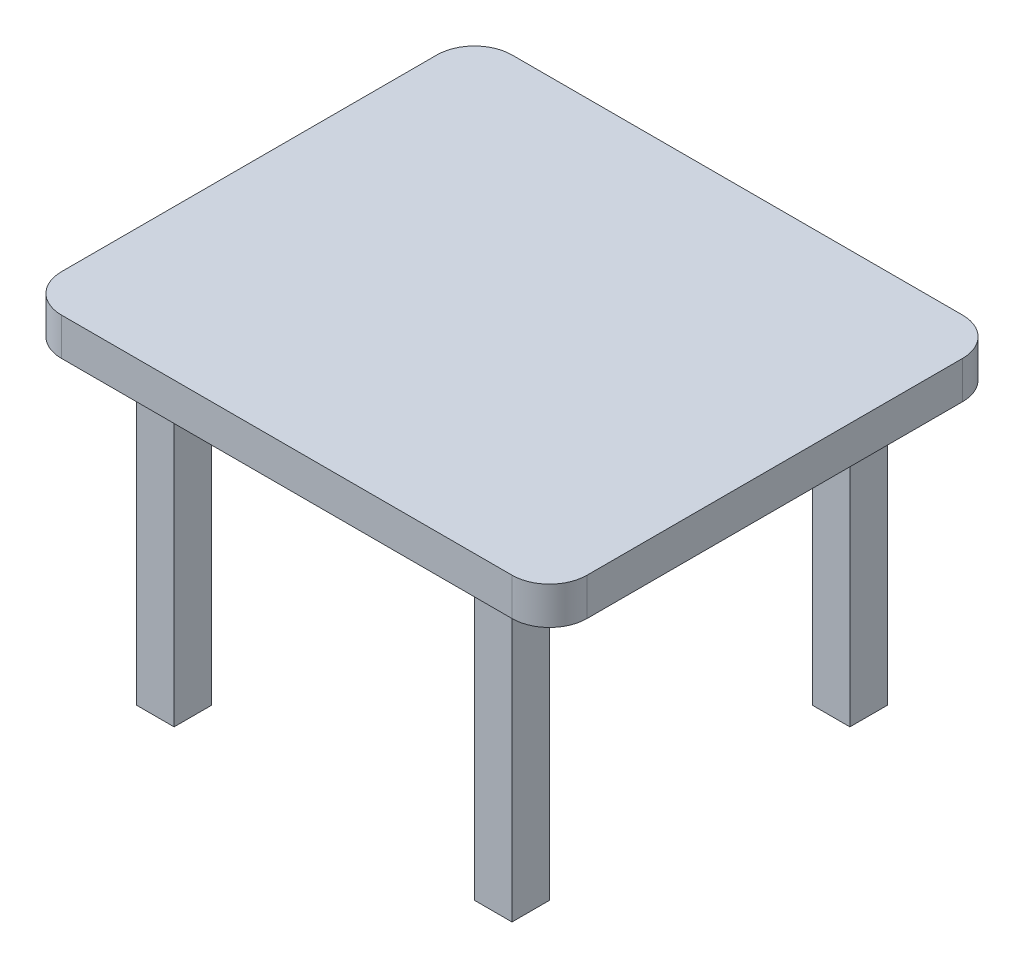
ISO-10303-21;
HEADER;
FILE_DESCRIPTION(('STEP AP214'),'2;1');
FILE_NAME('part.step','',(''),(''),'','','');
FILE_SCHEMA(('AUTOMOTIVE_DESIGN { 1 0 10303 214 1 1 1 1 }'));
ENDSEC;
DATA;
#1=APPLICATION_CONTEXT('core data for automotive mechanical design processes');
#2=APPLICATION_PROTOCOL_DEFINITION('international standard','automotive_design',2000,#1);
#3=PRODUCT_CONTEXT('',#1,'mechanical');
#4=PRODUCT('Part','Part','',(#3));
#5=PRODUCT_RELATED_PRODUCT_CATEGORY('part','',(#4));
#6=PRODUCT_DEFINITION_FORMATION('','',#4);
#7=PRODUCT_DEFINITION_CONTEXT('part definition',#1,'design');
#8=PRODUCT_DEFINITION('design','',#6,#7);
#9=PRODUCT_DEFINITION_SHAPE('','',#8);
#10=(LENGTH_UNIT() NAMED_UNIT(*) SI_UNIT(.MILLI.,.METRE.));
#11=(NAMED_UNIT(*) PLANE_ANGLE_UNIT() SI_UNIT($,.RADIAN.));
#12=(NAMED_UNIT(*) SI_UNIT($,.STERADIAN.) SOLID_ANGLE_UNIT());
#13=UNCERTAINTY_MEASURE_WITH_UNIT(LENGTH_MEASURE(1.E-05),#10,'distance_accuracy_value','');
#14=(GEOMETRIC_REPRESENTATION_CONTEXT(3) GLOBAL_UNCERTAINTY_ASSIGNED_CONTEXT((#13)) GLOBAL_UNIT_ASSIGNED_CONTEXT((#10,
#11,#12)) REPRESENTATION_CONTEXT('',''));
#15=CARTESIAN_POINT('',(0.,0.,0.));
#16=DIRECTION('',(0.,0.,1.));
#17=DIRECTION('',(1.,0.,0.));
#18=AXIS2_PLACEMENT_3D('',#15,#16,#17);
#19=CARTESIAN_POINT('',(0.,80.,0.));
#20=DIRECTION('',(0.,1.,0.));
#21=DIRECTION('',(0.,0.,1.));
#22=AXIS2_PLACEMENT_3D('',#19,#20,#21);
#23=PLANE('',#22);
#24=DIRECTION('',(-1.,0.,0.));
#25=VECTOR('',#24,1.);
#26=CARTESIAN_POINT('',(-90.,80.,-10.));
#27=LINE('',#26,#25);
#28=CARTESIAN_POINT('',(-90.,80.,-10.));
#29=VERTEX_POINT('',#28);
#30=CARTESIAN_POINT('',(-100.,80.,-10.));
#31=VERTEX_POINT('',#30);
#32=EDGE_CURVE('E237',#29,#31,#27,.T.);
#33=ORIENTED_EDGE('',*,*,#32,.T.);
#34=DIRECTION('',(0.,0.,1.));
#35=VECTOR('',#34,1.);
#36=CARTESIAN_POINT('',(-100.,80.,-10.));
#37=LINE('',#36,#35);
#38=CARTESIAN_POINT('',(-100.,80.,0.));
#39=VERTEX_POINT('',#38);
#40=EDGE_CURVE('E239',#31,#39,#37,.T.);
#41=ORIENTED_EDGE('',*,*,#40,.T.);
#42=DIRECTION('',(1.,0.,0.));
#43=VECTOR('',#42,1.);
#44=CARTESIAN_POINT('',(-90.,80.,0.));
#45=LINE('',#44,#43);
#46=CARTESIAN_POINT('',(-90.,80.,0.));
#47=VERTEX_POINT('',#46);
#48=EDGE_CURVE('E242',#39,#47,#45,.T.);
#49=ORIENTED_EDGE('',*,*,#48,.T.);
#50=DIRECTION('',(0.,0.,-1.));
#51=VECTOR('',#50,1.);
#52=CARTESIAN_POINT('',(-90.,80.,-10.));
#53=LINE('',#52,#51);
#54=EDGE_CURVE('E244',#47,#29,#53,.T.);
#55=ORIENTED_EDGE('',*,*,#54,.T.);
#56=EDGE_LOOP('',(#33,#41,#49,#55));
#57=FACE_BOUND('',#56,.T.);
#58=DIRECTION('',(1.,0.,0.));
#59=VECTOR('',#58,1.);
#60=CARTESIAN_POINT('',(-10.,80.,0.));
#61=LINE('',#60,#59);
#62=CARTESIAN_POINT('',(-10.,80.,0.));
#63=VERTEX_POINT('',#62);
#64=CARTESIAN_POINT('',(0.,80.,0.));
#65=VERTEX_POINT('',#64);
#66=EDGE_CURVE('E326',#63,#65,#61,.T.);
#67=ORIENTED_EDGE('',*,*,#66,.T.);
#68=DIRECTION('',(0.,0.,-1.));
#69=VECTOR('',#68,1.);
#70=CARTESIAN_POINT('',(0.,80.,-10.));
#71=LINE('',#70,#69);
#72=CARTESIAN_POINT('',(0.,80.,-10.));
#73=VERTEX_POINT('',#72);
#74=EDGE_CURVE('E316',#65,#73,#71,.T.);
#75=ORIENTED_EDGE('',*,*,#74,.T.);
#76=DIRECTION('',(-1.,0.,0.));
#77=VECTOR('',#76,1.);
#78=CARTESIAN_POINT('',(-10.,80.,-10.));
#79=LINE('',#78,#77);
#80=CARTESIAN_POINT('',(-10.,80.,-10.));
#81=VERTEX_POINT('',#80);
#82=EDGE_CURVE('E319',#73,#81,#79,.T.);
#83=ORIENTED_EDGE('',*,*,#82,.T.);
#84=DIRECTION('',(0.,0.,1.));
#85=VECTOR('',#84,1.);
#86=CARTESIAN_POINT('',(-10.,80.,-10.));
#87=LINE('',#86,#85);
#88=EDGE_CURVE('E323',#81,#63,#87,.T.);
#89=ORIENTED_EDGE('',*,*,#88,.T.);
#90=EDGE_LOOP('',(#67,#75,#83,#89));
#91=FACE_BOUND('',#90,.T.);
#92=DIRECTION('',(0.,0.,1.));
#93=VECTOR('',#92,1.);
#94=CARTESIAN_POINT('',(-120.,80.,-110.));
#95=LINE('',#94,#93);
#96=CARTESIAN_POINT('',(-120.,80.,-100.));
#97=VERTEX_POINT('',#96);
#98=CARTESIAN_POINT('',(-120.,80.,0.));
#99=VERTEX_POINT('',#98);
#100=EDGE_CURVE('E294',#97,#99,#95,.T.);
#101=ORIENTED_EDGE('',*,*,#100,.F.);
#102=CARTESIAN_POINT('',(-110.,80.,-100.));
#103=DIRECTION('',(0.,1.,0.));
#104=DIRECTION('',(0.,0.,1.));
#105=AXIS2_PLACEMENT_3D('',#102,#103,#104);
#106=CIRCLE('',#105,10.);
#107=CARTESIAN_POINT('',(-110.,80.,-110.));
#108=VERTEX_POINT('',#107);
#109=EDGE_CURVE('E359',#97,#108,#106,.F.);
#110=ORIENTED_EDGE('',*,*,#109,.T.);
#111=DIRECTION('',(-1.,0.,0.));
#112=VECTOR('',#111,1.);
#113=CARTESIAN_POINT('',(-120.,80.,-110.));
#114=LINE('',#113,#112);
#115=CARTESIAN_POINT('',(9.99999999999999,80.,-110.));
#116=VERTEX_POINT('',#115);
#117=EDGE_CURVE('E299',#116,#108,#114,.T.);
#118=ORIENTED_EDGE('',*,*,#117,.F.);
#119=CARTESIAN_POINT('',(9.99999999999999,80.,-100.));
#120=DIRECTION('',(0.,1.,0.));
#121=DIRECTION('',(0.,0.,1.));
#122=AXIS2_PLACEMENT_3D('',#119,#120,#121);
#123=CIRCLE('',#122,10.);
#124=CARTESIAN_POINT('',(20.,80.,-100.));
#125=VERTEX_POINT('',#124);
#126=EDGE_CURVE('E357',#116,#125,#123,.F.);
#127=ORIENTED_EDGE('',*,*,#126,.T.);
#128=DIRECTION('',(0.,0.,-1.));
#129=VECTOR('',#128,1.);
#130=CARTESIAN_POINT('',(20.,80.,-110.));
#131=LINE('',#130,#129);
#132=CARTESIAN_POINT('',(20.,80.,0.));
#133=VERTEX_POINT('',#132);
#134=EDGE_CURVE('E312',#133,#125,#131,.T.);
#135=ORIENTED_EDGE('',*,*,#134,.F.);
#136=CARTESIAN_POINT('',(10.,80.,0.));
#137=DIRECTION('',(0.,1.,0.));
#138=DIRECTION('',(0.,0.,1.));
#139=AXIS2_PLACEMENT_3D('',#136,#137,#138);
#140=CIRCLE('',#139,10.);
#141=CARTESIAN_POINT('',(10.,80.,10.));
#142=VERTEX_POINT('',#141);
#143=EDGE_CURVE('E353',#133,#142,#140,.F.);
#144=ORIENTED_EDGE('',*,*,#143,.T.);
#145=DIRECTION('',(1.,0.,0.));
#146=VECTOR('',#145,1.);
#147=CARTESIAN_POINT('',(-120.,80.,10.));
#148=LINE('',#147,#146);
#149=CARTESIAN_POINT('',(-110.,80.,10.));
#150=VERTEX_POINT('',#149);
#151=EDGE_CURVE('E309',#150,#142,#148,.T.);
#152=ORIENTED_EDGE('',*,*,#151,.F.);
#153=CARTESIAN_POINT('',(-110.,80.,0.));
#154=DIRECTION('',(0.,1.,0.));
#155=DIRECTION('',(0.,0.,1.));
#156=AXIS2_PLACEMENT_3D('',#153,#154,#155);
#157=CIRCLE('',#156,10.);
#158=EDGE_CURVE('E355',#150,#99,#157,.F.);
#159=ORIENTED_EDGE('',*,*,#158,.T.);
#160=EDGE_LOOP('',(#101,#110,#118,#127,#135,#144,#152,#159));
#161=FACE_BOUND('',#160,.T.);
#162=DIRECTION('',(0.,0.,-1.));
#163=VECTOR('',#162,1.);
#164=CARTESIAN_POINT('',(0.,80.,-100.));
#165=LINE('',#164,#163);
#166=CARTESIAN_POINT('',(0.,80.,-90.));
#167=VERTEX_POINT('',#166);
#168=CARTESIAN_POINT('',(0.,80.,-100.));
#169=VERTEX_POINT('',#168);
#170=EDGE_CURVE('E266',#167,#169,#165,.T.);
#171=ORIENTED_EDGE('',*,*,#170,.T.);
#172=DIRECTION('',(-1.,0.,0.));
#173=VECTOR('',#172,1.);
#174=CARTESIAN_POINT('',(-10.,80.,-100.));
#175=LINE('',#174,#173);
#176=CARTESIAN_POINT('',(-10.,80.,-100.));
#177=VERTEX_POINT('',#176);
#178=EDGE_CURVE('E268',#169,#177,#175,.T.);
#179=ORIENTED_EDGE('',*,*,#178,.T.);
#180=DIRECTION('',(0.,0.,1.));
#181=VECTOR('',#180,1.);
#182=CARTESIAN_POINT('',(-10.,80.,-100.));
#183=LINE('',#182,#181);
#184=CARTESIAN_POINT('',(-10.,80.,-90.));
#185=VERTEX_POINT('',#184);
#186=EDGE_CURVE('E271',#177,#185,#183,.T.);
#187=ORIENTED_EDGE('',*,*,#186,.T.);
#188=DIRECTION('',(1.,0.,0.));
#189=VECTOR('',#188,1.);
#190=CARTESIAN_POINT('',(-10.,80.,-90.));
#191=LINE('',#190,#189);
#192=EDGE_CURVE('E273',#185,#167,#191,.T.);
#193=ORIENTED_EDGE('',*,*,#192,.T.);
#194=EDGE_LOOP('',(#171,#179,#187,#193));
#195=FACE_BOUND('',#194,.T.);
#196=DIRECTION('',(-1.,0.,0.));
#197=VECTOR('',#196,1.);
#198=CARTESIAN_POINT('',(-90.,80.,-100.));
#199=LINE('',#198,#197);
#200=CARTESIAN_POINT('',(-90.,80.,-100.));
#201=VERTEX_POINT('',#200);
#202=CARTESIAN_POINT('',(-100.,80.,-100.));
#203=VERTEX_POINT('',#202);
#204=EDGE_CURVE('E230',#201,#203,#199,.T.);
#205=ORIENTED_EDGE('',*,*,#204,.T.);
#206=DIRECTION('',(0.,0.,1.));
#207=VECTOR('',#206,1.);
#208=CARTESIAN_POINT('',(-100.,80.,-100.));
#209=LINE('',#208,#207);
#210=CARTESIAN_POINT('',(-100.,80.,-90.));
#211=VERTEX_POINT('',#210);
#212=EDGE_CURVE('E201',#203,#211,#209,.T.);
#213=ORIENTED_EDGE('',*,*,#212,.T.);
#214=DIRECTION('',(1.,0.,0.));
#215=VECTOR('',#214,1.);
#216=CARTESIAN_POINT('',(-90.,80.,-90.));
#217=LINE('',#216,#215);
#218=CARTESIAN_POINT('',(-90.,80.,-90.));
#219=VERTEX_POINT('',#218);
#220=EDGE_CURVE('E195',#211,#219,#217,.T.);
#221=ORIENTED_EDGE('',*,*,#220,.T.);
#222=DIRECTION('',(0.,0.,-1.));
#223=VECTOR('',#222,1.);
#224=CARTESIAN_POINT('',(-90.,80.,-100.));
#225=LINE('',#224,#223);
#226=EDGE_CURVE('E198',#219,#201,#225,.T.);
#227=ORIENTED_EDGE('',*,*,#226,.T.);
#228=EDGE_LOOP('',(#205,#213,#221,#227));
#229=FACE_BOUND('',#228,.T.);
#230=ADVANCED_FACE('F33',(#57,#91,#161,#195,#229),#23,.F.);
#231=CARTESIAN_POINT('',(0.,80.,-10.));
#232=DIRECTION('',(-1.,0.,0.));
#233=DIRECTION('',(0.,0.,1.));
#234=AXIS2_PLACEMENT_3D('',#231,#232,#233);
#235=PLANE('',#234);
#236=DIRECTION('',(0.,0.,-1.));
#237=VECTOR('',#236,1.);
#238=CARTESIAN_POINT('',(0.,0.,-10.));
#239=LINE('',#238,#237);
#240=CARTESIAN_POINT('',(0.,0.,0.));
#241=VERTEX_POINT('',#240);
#242=CARTESIAN_POINT('',(0.,0.,-10.));
#243=VERTEX_POINT('',#242);
#244=EDGE_CURVE('E306',#241,#243,#239,.T.);
#245=ORIENTED_EDGE('',*,*,#244,.T.);
#246=DIRECTION('',(0.,-1.,0.));
#247=VECTOR('',#246,1.);
#248=CARTESIAN_POINT('',(0.,80.,-10.));
#249=LINE('',#248,#247);
#250=EDGE_CURVE('E345',#73,#243,#249,.T.);
#251=ORIENTED_EDGE('',*,*,#250,.F.);
#252=ORIENTED_EDGE('',*,*,#74,.F.);
#253=DIRECTION('',(0.,-1.,0.));
#254=VECTOR('',#253,1.);
#255=CARTESIAN_POINT('',(0.,80.,0.));
#256=LINE('',#255,#254);
#257=EDGE_CURVE('E329',#65,#241,#256,.T.);
#258=ORIENTED_EDGE('',*,*,#257,.T.);
#259=EDGE_LOOP('',(#245,#251,#252,#258));
#260=FACE_BOUND('',#259,.T.);
#261=ADVANCED_FACE('F417',(#260),#235,.F.);
#262=CARTESIAN_POINT('',(-10.,80.,-10.));
#263=DIRECTION('',(0.,0.,1.));
#264=DIRECTION('',(1.,0.,0.));
#265=AXIS2_PLACEMENT_3D('',#262,#263,#264);
#266=PLANE('',#265);
#267=DIRECTION('',(-1.,0.,0.));
#268=VECTOR('',#267,1.);
#269=CARTESIAN_POINT('',(-10.,0.,-10.));
#270=LINE('',#269,#268);
#271=CARTESIAN_POINT('',(-10.,0.,-10.));
#272=VERTEX_POINT('',#271);
#273=EDGE_CURVE('E332',#243,#272,#270,.T.);
#274=ORIENTED_EDGE('',*,*,#273,.T.);
#275=DIRECTION('',(0.,-1.,0.));
#276=VECTOR('',#275,1.);
#277=CARTESIAN_POINT('',(-10.,80.,-10.));
#278=LINE('',#277,#276);
#279=EDGE_CURVE('E342',#81,#272,#278,.T.);
#280=ORIENTED_EDGE('',*,*,#279,.F.);
#281=ORIENTED_EDGE('',*,*,#82,.F.);
#282=ORIENTED_EDGE('',*,*,#250,.T.);
#283=EDGE_LOOP('',(#274,#280,#281,#282));
#284=FACE_BOUND('',#283,.T.);
#285=ADVANCED_FACE('F423',(#284),#266,.F.);
#286=CARTESIAN_POINT('',(-10.,80.,-10.));
#287=DIRECTION('',(1.,0.,0.));
#288=DIRECTION('',(0.,0.,-1.));
#289=AXIS2_PLACEMENT_3D('',#286,#287,#288);
#290=PLANE('',#289);
#291=DIRECTION('',(0.,0.,1.));
#292=VECTOR('',#291,1.);
#293=CARTESIAN_POINT('',(-10.,0.,-10.));
#294=LINE('',#293,#292);
#295=CARTESIAN_POINT('',(-10.,0.,0.));
#296=VERTEX_POINT('',#295);
#297=EDGE_CURVE('E334',#272,#296,#294,.T.);
#298=ORIENTED_EDGE('',*,*,#297,.T.);
#299=DIRECTION('',(0.,-1.,0.));
#300=VECTOR('',#299,1.);
#301=CARTESIAN_POINT('',(-10.,80.,0.));
#302=LINE('',#301,#300);
#303=EDGE_CURVE('E339',#63,#296,#302,.T.);
#304=ORIENTED_EDGE('',*,*,#303,.F.);
#305=ORIENTED_EDGE('',*,*,#88,.F.);
#306=ORIENTED_EDGE('',*,*,#279,.T.);
#307=EDGE_LOOP('',(#298,#304,#305,#306));
#308=FACE_BOUND('',#307,.T.);
#309=ADVANCED_FACE('F445',(#308),#290,.F.);
#310=CARTESIAN_POINT('',(-10.,80.,0.));
#311=DIRECTION('',(0.,0.,-1.));
#312=DIRECTION('',(-1.,0.,0.));
#313=AXIS2_PLACEMENT_3D('',#310,#311,#312);
#314=PLANE('',#313);
#315=DIRECTION('',(1.,0.,0.));
#316=VECTOR('',#315,1.);
#317=CARTESIAN_POINT('',(-10.,0.,0.));
#318=LINE('',#317,#316);
#319=EDGE_CURVE('E320',#296,#241,#318,.T.);
#320=ORIENTED_EDGE('',*,*,#319,.T.);
#321=ORIENTED_EDGE('',*,*,#257,.F.);
#322=ORIENTED_EDGE('',*,*,#66,.F.);
#323=ORIENTED_EDGE('',*,*,#303,.T.);
#324=EDGE_LOOP('',(#320,#321,#322,#323));
#325=FACE_BOUND('',#324,.T.);
#326=ADVANCED_FACE('F441',(#325),#314,.F.);
#327=CARTESIAN_POINT('',(0.,0.,0.));
#328=DIRECTION('',(0.,1.,0.));
#329=DIRECTION('',(0.,0.,1.));
#330=AXIS2_PLACEMENT_3D('',#327,#328,#329);
#331=PLANE('',#330);
#332=ORIENTED_EDGE('',*,*,#244,.F.);
#333=ORIENTED_EDGE('',*,*,#319,.F.);
#334=ORIENTED_EDGE('',*,*,#297,.F.);
#335=ORIENTED_EDGE('',*,*,#273,.F.);
#336=EDGE_LOOP('',(#332,#333,#334,#335));
#337=FACE_BOUND('',#336,.T.);
#338=ADVANCED_FACE('F438',(#337),#331,.F.);
#339=CARTESIAN_POINT('',(-120.,90.,-110.));
#340=DIRECTION('',(1.,0.,0.));
#341=DIRECTION('',(0.,0.,-1.));
#342=AXIS2_PLACEMENT_3D('',#339,#340,#341);
#343=PLANE('',#342);
#344=DIRECTION('',(0.,0.,1.));
#345=VECTOR('',#344,1.);
#346=CARTESIAN_POINT('',(-120.,90.,-110.));
#347=LINE('',#346,#345);
#348=CARTESIAN_POINT('',(-120.,90.,-100.));
#349=VERTEX_POINT('',#348);
#350=CARTESIAN_POINT('',(-120.,90.,0.));
#351=VERTEX_POINT('',#350);
#352=EDGE_CURVE('E295',#349,#351,#347,.T.);
#353=ORIENTED_EDGE('',*,*,#352,.F.);
#354=DIRECTION('',(0.,-1.,0.));
#355=VECTOR('',#354,1.);
#356=CARTESIAN_POINT('',(-120.,90.,-100.));
#357=LINE('',#356,#355);
#358=EDGE_CURVE('E350',#349,#97,#357,.T.);
#359=ORIENTED_EDGE('',*,*,#358,.T.);
#360=ORIENTED_EDGE('',*,*,#100,.T.);
#361=DIRECTION('',(0.,-1.,0.));
#362=VECTOR('',#361,1.);
#363=CARTESIAN_POINT('',(-120.,90.,0.));
#364=LINE('',#363,#362);
#365=EDGE_CURVE('E348',#99,#351,#364,.F.);
#366=ORIENTED_EDGE('',*,*,#365,.T.);
#367=EDGE_LOOP('',(#353,#359,#360,#366));
#368=FACE_BOUND('',#367,.T.);
#369=ADVANCED_FACE('F406',(#368),#343,.F.);
#370=CARTESIAN_POINT('',(-120.,90.,10.));
#371=DIRECTION('',(0.,0.,-1.));
#372=DIRECTION('',(-1.,0.,0.));
#373=AXIS2_PLACEMENT_3D('',#370,#371,#372);
#374=PLANE('',#373);
#375=DIRECTION('',(1.,0.,0.));
#376=VECTOR('',#375,1.);
#377=CARTESIAN_POINT('',(-120.,90.,10.));
#378=LINE('',#377,#376);
#379=CARTESIAN_POINT('',(-110.,90.,10.));
#380=VERTEX_POINT('',#379);
#381=CARTESIAN_POINT('',(10.,90.,10.));
#382=VERTEX_POINT('',#381);
#383=EDGE_CURVE('E298',#380,#382,#378,.T.);
#384=ORIENTED_EDGE('',*,*,#383,.F.);
#385=DIRECTION('',(0.,-1.,0.));
#386=VECTOR('',#385,1.);
#387=CARTESIAN_POINT('',(-110.,90.,10.));
#388=LINE('',#387,#386);
#389=EDGE_CURVE('E11',#380,#150,#388,.T.);
#390=ORIENTED_EDGE('',*,*,#389,.T.);
#391=ORIENTED_EDGE('',*,*,#151,.T.);
#392=DIRECTION('',(0.,-1.,0.));
#393=VECTOR('',#392,1.);
#394=CARTESIAN_POINT('',(10.,90.,10.));
#395=LINE('',#394,#393);
#396=EDGE_CURVE('E41',#142,#382,#395,.F.);
#397=ORIENTED_EDGE('',*,*,#396,.T.);
#398=EDGE_LOOP('',(#384,#390,#391,#397));
#399=FACE_BOUND('',#398,.T.);
#400=ADVANCED_FACE('F379',(#399),#374,.F.);
#401=CARTESIAN_POINT('',(20.,90.,-110.));
#402=DIRECTION('',(-1.,0.,0.));
#403=DIRECTION('',(0.,0.,1.));
#404=AXIS2_PLACEMENT_3D('',#401,#402,#403);
#405=PLANE('',#404);
#406=ORIENTED_EDGE('',*,*,#134,.T.);
#407=DIRECTION('',(0.,-1.,0.));
#408=VECTOR('',#407,1.);
#409=CARTESIAN_POINT('',(20.,90.,-100.));
#410=LINE('',#409,#408);
#411=CARTESIAN_POINT('',(20.,90.,-100.));
#412=VERTEX_POINT('',#411);
#413=EDGE_CURVE('E48',#125,#412,#410,.F.);
#414=ORIENTED_EDGE('',*,*,#413,.T.);
#415=DIRECTION('',(0.,0.,-1.));
#416=VECTOR('',#415,1.);
#417=CARTESIAN_POINT('',(20.,90.,-110.));
#418=LINE('',#417,#416);
#419=CARTESIAN_POINT('',(20.,90.,0.));
#420=VERTEX_POINT('',#419);
#421=EDGE_CURVE('E301',#420,#412,#418,.T.);
#422=ORIENTED_EDGE('',*,*,#421,.F.);
#423=DIRECTION('',(0.,-1.,0.));
#424=VECTOR('',#423,1.);
#425=CARTESIAN_POINT('',(20.,90.,0.));
#426=LINE('',#425,#424);
#427=EDGE_CURVE('E373',#420,#133,#426,.T.);
#428=ORIENTED_EDGE('',*,*,#427,.T.);
#429=EDGE_LOOP('',(#406,#414,#422,#428));
#430=FACE_BOUND('',#429,.T.);
#431=ADVANCED_FACE('F387',(#430),#405,.F.);
#432=CARTESIAN_POINT('',(-120.,90.,-110.));
#433=DIRECTION('',(0.,0.,1.));
#434=DIRECTION('',(1.,0.,0.));
#435=AXIS2_PLACEMENT_3D('',#432,#433,#434);
#436=PLANE('',#435);
#437=ORIENTED_EDGE('',*,*,#117,.T.);
#438=DIRECTION('',(0.,-1.,0.));
#439=VECTOR('',#438,1.);
#440=CARTESIAN_POINT('',(-110.,90.,-110.));
#441=LINE('',#440,#439);
#442=CARTESIAN_POINT('',(-110.,90.,-110.));
#443=VERTEX_POINT('',#442);
#444=EDGE_CURVE('E364',#108,#443,#441,.F.);
#445=ORIENTED_EDGE('',*,*,#444,.T.);
#446=DIRECTION('',(-1.,0.,0.));
#447=VECTOR('',#446,1.);
#448=CARTESIAN_POINT('',(-120.,90.,-110.));
#449=LINE('',#448,#447);
#450=CARTESIAN_POINT('',(9.99999999999999,90.,-110.));
#451=VERTEX_POINT('',#450);
#452=EDGE_CURVE('E303',#451,#443,#449,.T.);
#453=ORIENTED_EDGE('',*,*,#452,.F.);
#454=DIRECTION('',(0.,-1.,0.));
#455=VECTOR('',#454,1.);
#456=CARTESIAN_POINT('',(9.99999999999999,90.,-110.));
#457=LINE('',#456,#455);
#458=EDGE_CURVE('E361',#451,#116,#457,.T.);
#459=ORIENTED_EDGE('',*,*,#458,.T.);
#460=EDGE_LOOP('',(#437,#445,#453,#459));
#461=FACE_BOUND('',#460,.T.);
#462=ADVANCED_FACE('F398',(#461),#436,.F.);
#463=CARTESIAN_POINT('',(0.,90.,0.));
#464=DIRECTION('',(0.,1.,0.));
#465=DIRECTION('',(0.,0.,1.));
#466=AXIS2_PLACEMENT_3D('',#463,#464,#465);
#467=PLANE('',#466);
#468=ORIENTED_EDGE('',*,*,#452,.T.);
#469=CARTESIAN_POINT('',(-110.,90.,-100.));
#470=DIRECTION('',(0.,1.,0.));
#471=DIRECTION('',(0.,0.,1.));
#472=AXIS2_PLACEMENT_3D('',#469,#470,#471);
#473=CIRCLE('',#472,10.);
#474=EDGE_CURVE('E371',#443,#349,#473,.T.);
#475=ORIENTED_EDGE('',*,*,#474,.T.);
#476=ORIENTED_EDGE('',*,*,#352,.T.);
#477=CARTESIAN_POINT('',(-110.,90.,0.));
#478=DIRECTION('',(0.,1.,0.));
#479=DIRECTION('',(0.,0.,1.));
#480=AXIS2_PLACEMENT_3D('',#477,#478,#479);
#481=CIRCLE('',#480,10.);
#482=EDGE_CURVE('E367',#351,#380,#481,.T.);
#483=ORIENTED_EDGE('',*,*,#482,.T.);
#484=ORIENTED_EDGE('',*,*,#383,.T.);
#485=CARTESIAN_POINT('',(10.,90.,0.));
#486=DIRECTION('',(0.,1.,0.));
#487=DIRECTION('',(0.,0.,1.));
#488=AXIS2_PLACEMENT_3D('',#485,#486,#487);
#489=CIRCLE('',#488,10.);
#490=EDGE_CURVE('E55',#382,#420,#489,.T.);
#491=ORIENTED_EDGE('',*,*,#490,.T.);
#492=ORIENTED_EDGE('',*,*,#421,.T.);
#493=CARTESIAN_POINT('',(9.99999999999999,90.,-100.));
#494=DIRECTION('',(0.,1.,0.));
#495=DIRECTION('',(0.,0.,1.));
#496=AXIS2_PLACEMENT_3D('',#493,#494,#495);
#497=CIRCLE('',#496,10.);
#498=EDGE_CURVE('E369',#412,#451,#497,.T.);
#499=ORIENTED_EDGE('',*,*,#498,.T.);
#500=EDGE_LOOP('',(#468,#475,#476,#483,#484,#491,#492,#499));
#501=FACE_BOUND('',#500,.T.);
#502=ADVANCED_FACE('F383',(#501),#467,.T.);
#503=CARTESIAN_POINT('',(0.,80.,-100.));
#504=DIRECTION('',(-1.,0.,0.));
#505=DIRECTION('',(0.,0.,1.));
#506=AXIS2_PLACEMENT_3D('',#503,#504,#505);
#507=PLANE('',#506);
#508=DIRECTION('',(0.,0.,-1.));
#509=VECTOR('',#508,1.);
#510=CARTESIAN_POINT('',(0.,0.,-100.));
#511=LINE('',#510,#509);
#512=CARTESIAN_POINT('',(0.,0.,-90.));
#513=VERTEX_POINT('',#512);
#514=CARTESIAN_POINT('',(0.,0.,-100.));
#515=VERTEX_POINT('',#514);
#516=EDGE_CURVE('E265',#513,#515,#511,.T.);
#517=ORIENTED_EDGE('',*,*,#516,.T.);
#518=DIRECTION('',(0.,-1.,0.));
#519=VECTOR('',#518,1.);
#520=CARTESIAN_POINT('',(0.,80.,-100.));
#521=LINE('',#520,#519);
#522=EDGE_CURVE('E291',#169,#515,#521,.T.);
#523=ORIENTED_EDGE('',*,*,#522,.F.);
#524=ORIENTED_EDGE('',*,*,#170,.F.);
#525=DIRECTION('',(0.,-1.,0.));
#526=VECTOR('',#525,1.);
#527=CARTESIAN_POINT('',(0.,80.,-90.));
#528=LINE('',#527,#526);
#529=EDGE_CURVE('E275',#167,#513,#528,.T.);
#530=ORIENTED_EDGE('',*,*,#529,.T.);
#531=EDGE_LOOP('',(#517,#523,#524,#530));
#532=FACE_BOUND('',#531,.T.);
#533=ADVANCED_FACE('F510',(#532),#507,.F.);
#534=CARTESIAN_POINT('',(-10.,80.,-100.));
#535=DIRECTION('',(0.,0.,1.));
#536=DIRECTION('',(1.,0.,0.));
#537=AXIS2_PLACEMENT_3D('',#534,#535,#536);
#538=PLANE('',#537);
#539=DIRECTION('',(-1.,0.,0.));
#540=VECTOR('',#539,1.);
#541=CARTESIAN_POINT('',(-10.,0.,-100.));
#542=LINE('',#541,#540);
#543=CARTESIAN_POINT('',(-10.,0.,-100.));
#544=VERTEX_POINT('',#543);
#545=EDGE_CURVE('E278',#515,#544,#542,.T.);
#546=ORIENTED_EDGE('',*,*,#545,.T.);
#547=DIRECTION('',(0.,-1.,0.));
#548=VECTOR('',#547,1.);
#549=CARTESIAN_POINT('',(-10.,80.,-100.));
#550=LINE('',#549,#548);
#551=EDGE_CURVE('E288',#177,#544,#550,.T.);
#552=ORIENTED_EDGE('',*,*,#551,.F.);
#553=ORIENTED_EDGE('',*,*,#178,.F.);
#554=ORIENTED_EDGE('',*,*,#522,.T.);
#555=EDGE_LOOP('',(#546,#552,#553,#554));
#556=FACE_BOUND('',#555,.T.);
#557=ADVANCED_FACE('F507',(#556),#538,.F.);
#558=CARTESIAN_POINT('',(-10.,80.,-100.));
#559=DIRECTION('',(1.,0.,0.));
#560=DIRECTION('',(0.,0.,-1.));
#561=AXIS2_PLACEMENT_3D('',#558,#559,#560);
#562=PLANE('',#561);
#563=DIRECTION('',(0.,0.,1.));
#564=VECTOR('',#563,1.);
#565=CARTESIAN_POINT('',(-10.,0.,-100.));
#566=LINE('',#565,#564);
#567=CARTESIAN_POINT('',(-10.,0.,-90.));
#568=VERTEX_POINT('',#567);
#569=EDGE_CURVE('E280',#544,#568,#566,.T.);
#570=ORIENTED_EDGE('',*,*,#569,.T.);
#571=DIRECTION('',(0.,-1.,0.));
#572=VECTOR('',#571,1.);
#573=CARTESIAN_POINT('',(-10.,80.,-90.));
#574=LINE('',#573,#572);
#575=EDGE_CURVE('E285',#185,#568,#574,.T.);
#576=ORIENTED_EDGE('',*,*,#575,.F.);
#577=ORIENTED_EDGE('',*,*,#186,.F.);
#578=ORIENTED_EDGE('',*,*,#551,.T.);
#579=EDGE_LOOP('',(#570,#576,#577,#578));
#580=FACE_BOUND('',#579,.T.);
#581=ADVANCED_FACE('F503',(#580),#562,.F.);
#582=CARTESIAN_POINT('',(-10.,80.,-90.));
#583=DIRECTION('',(0.,0.,-1.));
#584=DIRECTION('',(-1.,0.,0.));
#585=AXIS2_PLACEMENT_3D('',#582,#583,#584);
#586=PLANE('',#585);
#587=DIRECTION('',(1.,0.,0.));
#588=VECTOR('',#587,1.);
#589=CARTESIAN_POINT('',(-10.,0.,-90.));
#590=LINE('',#589,#588);
#591=EDGE_CURVE('E269',#568,#513,#590,.T.);
#592=ORIENTED_EDGE('',*,*,#591,.T.);
#593=ORIENTED_EDGE('',*,*,#529,.F.);
#594=ORIENTED_EDGE('',*,*,#192,.F.);
#595=ORIENTED_EDGE('',*,*,#575,.T.);
#596=EDGE_LOOP('',(#592,#593,#594,#595));
#597=FACE_BOUND('',#596,.T.);
#598=ADVANCED_FACE('F499',(#597),#586,.F.);
#599=CARTESIAN_POINT('',(0.,0.,0.));
#600=DIRECTION('',(0.,1.,0.));
#601=DIRECTION('',(0.,0.,1.));
#602=AXIS2_PLACEMENT_3D('',#599,#600,#601);
#603=PLANE('',#602);
#604=ORIENTED_EDGE('',*,*,#516,.F.);
#605=ORIENTED_EDGE('',*,*,#591,.F.);
#606=ORIENTED_EDGE('',*,*,#569,.F.);
#607=ORIENTED_EDGE('',*,*,#545,.F.);
#608=EDGE_LOOP('',(#604,#605,#606,#607));
#609=FACE_BOUND('',#608,.T.);
#610=ADVANCED_FACE('F495',(#609),#603,.F.);
#611=CARTESIAN_POINT('',(-90.,80.,-10.));
#612=DIRECTION('',(0.,0.,1.));
#613=DIRECTION('',(1.,0.,0.));
#614=AXIS2_PLACEMENT_3D('',#611,#612,#613);
#615=PLANE('',#614);
#616=DIRECTION('',(-1.,0.,0.));
#617=VECTOR('',#616,1.);
#618=CARTESIAN_POINT('',(-90.,0.,-10.));
#619=LINE('',#618,#617);
#620=CARTESIAN_POINT('',(-90.,0.,-10.));
#621=VERTEX_POINT('',#620);
#622=CARTESIAN_POINT('',(-100.,0.,-10.));
#623=VERTEX_POINT('',#622);
#624=EDGE_CURVE('E236',#621,#623,#619,.T.);
#625=ORIENTED_EDGE('',*,*,#624,.T.);
#626=DIRECTION('',(0.,-1.,0.));
#627=VECTOR('',#626,1.);
#628=CARTESIAN_POINT('',(-100.,80.,-10.));
#629=LINE('',#628,#627);
#630=EDGE_CURVE('E262',#31,#623,#629,.T.);
#631=ORIENTED_EDGE('',*,*,#630,.F.);
#632=ORIENTED_EDGE('',*,*,#32,.F.);
#633=DIRECTION('',(0.,-1.,0.));
#634=VECTOR('',#633,1.);
#635=CARTESIAN_POINT('',(-90.,80.,-10.));
#636=LINE('',#635,#634);
#637=EDGE_CURVE('E246',#29,#621,#636,.T.);
#638=ORIENTED_EDGE('',*,*,#637,.T.);
#639=EDGE_LOOP('',(#625,#631,#632,#638));
#640=FACE_BOUND('',#639,.T.);
#641=ADVANCED_FACE('F491',(#640),#615,.F.);
#642=CARTESIAN_POINT('',(-100.,80.,-10.));
#643=DIRECTION('',(1.,0.,0.));
#644=DIRECTION('',(0.,0.,-1.));
#645=AXIS2_PLACEMENT_3D('',#642,#643,#644);
#646=PLANE('',#645);
#647=DIRECTION('',(0.,0.,1.));
#648=VECTOR('',#647,1.);
#649=CARTESIAN_POINT('',(-100.,0.,-10.));
#650=LINE('',#649,#648);
#651=CARTESIAN_POINT('',(-100.,0.,0.));
#652=VERTEX_POINT('',#651);
#653=EDGE_CURVE('E249',#623,#652,#650,.T.);
#654=ORIENTED_EDGE('',*,*,#653,.T.);
#655=DIRECTION('',(0.,-1.,0.));
#656=VECTOR('',#655,1.);
#657=CARTESIAN_POINT('',(-100.,80.,0.));
#658=LINE('',#657,#656);
#659=EDGE_CURVE('E259',#39,#652,#658,.T.);
#660=ORIENTED_EDGE('',*,*,#659,.F.);
#661=ORIENTED_EDGE('',*,*,#40,.F.);
#662=ORIENTED_EDGE('',*,*,#630,.T.);
#663=EDGE_LOOP('',(#654,#660,#661,#662));
#664=FACE_BOUND('',#663,.T.);
#665=ADVANCED_FACE('F487',(#664),#646,.F.);
#666=CARTESIAN_POINT('',(-90.,80.,0.));
#667=DIRECTION('',(0.,0.,-1.));
#668=DIRECTION('',(-1.,0.,0.));
#669=AXIS2_PLACEMENT_3D('',#666,#667,#668);
#670=PLANE('',#669);
#671=DIRECTION('',(1.,0.,0.));
#672=VECTOR('',#671,1.);
#673=CARTESIAN_POINT('',(-90.,0.,0.));
#674=LINE('',#673,#672);
#675=CARTESIAN_POINT('',(-90.,0.,0.));
#676=VERTEX_POINT('',#675);
#677=EDGE_CURVE('E251',#652,#676,#674,.T.);
#678=ORIENTED_EDGE('',*,*,#677,.T.);
#679=DIRECTION('',(0.,-1.,0.));
#680=VECTOR('',#679,1.);
#681=CARTESIAN_POINT('',(-90.,80.,0.));
#682=LINE('',#681,#680);
#683=EDGE_CURVE('E256',#47,#676,#682,.T.);
#684=ORIENTED_EDGE('',*,*,#683,.F.);
#685=ORIENTED_EDGE('',*,*,#48,.F.);
#686=ORIENTED_EDGE('',*,*,#659,.T.);
#687=EDGE_LOOP('',(#678,#684,#685,#686));
#688=FACE_BOUND('',#687,.T.);
#689=ADVANCED_FACE('F483',(#688),#670,.F.);
#690=CARTESIAN_POINT('',(-90.,80.,-10.));
#691=DIRECTION('',(-1.,0.,0.));
#692=DIRECTION('',(0.,0.,1.));
#693=AXIS2_PLACEMENT_3D('',#690,#691,#692);
#694=PLANE('',#693);
#695=DIRECTION('',(0.,0.,-1.));
#696=VECTOR('',#695,1.);
#697=CARTESIAN_POINT('',(-90.,0.,-10.));
#698=LINE('',#697,#696);
#699=EDGE_CURVE('E240',#676,#621,#698,.T.);
#700=ORIENTED_EDGE('',*,*,#699,.T.);
#701=ORIENTED_EDGE('',*,*,#637,.F.);
#702=ORIENTED_EDGE('',*,*,#54,.F.);
#703=ORIENTED_EDGE('',*,*,#683,.T.);
#704=EDGE_LOOP('',(#700,#701,#702,#703));
#705=FACE_BOUND('',#704,.T.);
#706=ADVANCED_FACE('F479',(#705),#694,.F.);
#707=CARTESIAN_POINT('',(0.,0.,0.));
#708=DIRECTION('',(0.,1.,0.));
#709=DIRECTION('',(0.,0.,1.));
#710=AXIS2_PLACEMENT_3D('',#707,#708,#709);
#711=PLANE('',#710);
#712=ORIENTED_EDGE('',*,*,#624,.F.);
#713=ORIENTED_EDGE('',*,*,#699,.F.);
#714=ORIENTED_EDGE('',*,*,#677,.F.);
#715=ORIENTED_EDGE('',*,*,#653,.F.);
#716=EDGE_LOOP('',(#712,#713,#714,#715));
#717=FACE_BOUND('',#716,.T.);
#718=ADVANCED_FACE('F475',(#717),#711,.F.);
#719=CARTESIAN_POINT('',(-90.,80.,-100.));
#720=DIRECTION('',(0.,0.,1.));
#721=DIRECTION('',(1.,0.,0.));
#722=AXIS2_PLACEMENT_3D('',#719,#720,#721);
#723=PLANE('',#722);
#724=DIRECTION('',(-1.,0.,0.));
#725=VECTOR('',#724,1.);
#726=CARTESIAN_POINT('',(-90.,0.,-100.));
#727=LINE('',#726,#725);
#728=CARTESIAN_POINT('',(-90.,0.,-100.));
#729=VERTEX_POINT('',#728);
#730=CARTESIAN_POINT('',(-100.,0.,-100.));
#731=VERTEX_POINT('',#730);
#732=EDGE_CURVE('E223',#729,#731,#727,.T.);
#733=ORIENTED_EDGE('',*,*,#732,.T.);
#734=DIRECTION('',(0.,-1.,0.));
#735=VECTOR('',#734,1.);
#736=CARTESIAN_POINT('',(-100.,80.,-100.));
#737=LINE('',#736,#735);
#738=EDGE_CURVE('E233',#203,#731,#737,.T.);
#739=ORIENTED_EDGE('',*,*,#738,.F.);
#740=ORIENTED_EDGE('',*,*,#204,.F.);
#741=DIRECTION('',(0.,-1.,0.));
#742=VECTOR('',#741,1.);
#743=CARTESIAN_POINT('',(-90.,80.,-100.));
#744=LINE('',#743,#742);
#745=EDGE_CURVE('E214',#201,#729,#744,.T.);
#746=ORIENTED_EDGE('',*,*,#745,.T.);
#747=EDGE_LOOP('',(#733,#739,#740,#746));
#748=FACE_BOUND('',#747,.T.);
#749=ADVANCED_FACE('F471',(#748),#723,.F.);
#750=CARTESIAN_POINT('',(-100.,80.,-100.));
#751=DIRECTION('',(1.,0.,0.));
#752=DIRECTION('',(0.,0.,-1.));
#753=AXIS2_PLACEMENT_3D('',#750,#751,#752);
#754=PLANE('',#753);
#755=DIRECTION('',(0.,0.,1.));
#756=VECTOR('',#755,1.);
#757=CARTESIAN_POINT('',(-100.,0.,-100.));
#758=LINE('',#757,#756);
#759=CARTESIAN_POINT('',(-100.,0.,-90.));
#760=VERTEX_POINT('',#759);
#761=EDGE_CURVE('E226',#731,#760,#758,.T.);
#762=ORIENTED_EDGE('',*,*,#761,.T.);
#763=DIRECTION('',(0.,-1.,0.));
#764=VECTOR('',#763,1.);
#765=CARTESIAN_POINT('',(-100.,80.,-90.));
#766=LINE('',#765,#764);
#767=EDGE_CURVE('E213',#211,#760,#766,.T.);
#768=ORIENTED_EDGE('',*,*,#767,.F.);
#769=ORIENTED_EDGE('',*,*,#212,.F.);
#770=ORIENTED_EDGE('',*,*,#738,.T.);
#771=EDGE_LOOP('',(#762,#768,#769,#770));
#772=FACE_BOUND('',#771,.T.);
#773=ADVANCED_FACE('F468',(#772),#754,.F.);
#774=CARTESIAN_POINT('',(-90.,80.,-90.));
#775=DIRECTION('',(0.,0.,-1.));
#776=DIRECTION('',(-1.,0.,0.));
#777=AXIS2_PLACEMENT_3D('',#774,#775,#776);
#778=PLANE('',#777);
#779=DIRECTION('',(1.,0.,0.));
#780=VECTOR('',#779,1.);
#781=CARTESIAN_POINT('',(-90.,0.,-90.));
#782=LINE('',#781,#780);
#783=CARTESIAN_POINT('',(-90.,0.,-90.));
#784=VERTEX_POINT('',#783);
#785=EDGE_CURVE('E210',#760,#784,#782,.T.);
#786=ORIENTED_EDGE('',*,*,#785,.T.);
#787=DIRECTION('',(0.,-1.,0.));
#788=VECTOR('',#787,1.);
#789=CARTESIAN_POINT('',(-90.,80.,-90.));
#790=LINE('',#789,#788);
#791=EDGE_CURVE('E207',#219,#784,#790,.T.);
#792=ORIENTED_EDGE('',*,*,#791,.F.);
#793=ORIENTED_EDGE('',*,*,#220,.F.);
#794=ORIENTED_EDGE('',*,*,#767,.T.);
#795=EDGE_LOOP('',(#786,#792,#793,#794));
#796=FACE_BOUND('',#795,.T.);
#797=ADVANCED_FACE('F208',(#796),#778,.F.);
#798=CARTESIAN_POINT('',(-90.,80.,-100.));
#799=DIRECTION('',(-1.,0.,0.));
#800=DIRECTION('',(0.,0.,1.));
#801=AXIS2_PLACEMENT_3D('',#798,#799,#800);
#802=PLANE('',#801);
#803=DIRECTION('',(0.,0.,-1.));
#804=VECTOR('',#803,1.);
#805=CARTESIAN_POINT('',(-90.,0.,-100.));
#806=LINE('',#805,#804);
#807=EDGE_CURVE('E229',#784,#729,#806,.T.);
#808=ORIENTED_EDGE('',*,*,#807,.T.);
#809=ORIENTED_EDGE('',*,*,#745,.F.);
#810=ORIENTED_EDGE('',*,*,#226,.F.);
#811=ORIENTED_EDGE('',*,*,#791,.T.);
#812=EDGE_LOOP('',(#808,#809,#810,#811));
#813=FACE_BOUND('',#812,.T.);
#814=ADVANCED_FACE('F216',(#813),#802,.F.);
#815=CARTESIAN_POINT('',(0.,0.,0.));
#816=DIRECTION('',(0.,1.,0.));
#817=DIRECTION('',(0.,0.,1.));
#818=AXIS2_PLACEMENT_3D('',#815,#816,#817);
#819=PLANE('',#818);
#820=ORIENTED_EDGE('',*,*,#732,.F.);
#821=ORIENTED_EDGE('',*,*,#807,.F.);
#822=ORIENTED_EDGE('',*,*,#785,.F.);
#823=ORIENTED_EDGE('',*,*,#761,.F.);
#824=EDGE_LOOP('',(#820,#821,#822,#823));
#825=FACE_BOUND('',#824,.T.);
#826=ADVANCED_FACE('F454',(#825),#819,.F.);
#827=CARTESIAN_POINT('',(-110.,90.,-100.));
#828=DIRECTION('',(0.,-1.,0.));
#829=DIRECTION('',(0.,0.,-1.));
#830=AXIS2_PLACEMENT_3D('',#827,#828,#829);
#831=CYLINDRICAL_SURFACE('',#830,10.);
#832=ORIENTED_EDGE('',*,*,#474,.F.);
#833=ORIENTED_EDGE('',*,*,#444,.F.);
#834=ORIENTED_EDGE('',*,*,#109,.F.);
#835=ORIENTED_EDGE('',*,*,#358,.F.);
#836=EDGE_LOOP('',(#832,#833,#834,#835));
#837=FACE_BOUND('',#836,.T.);
#838=ADVANCED_FACE('F404',(#837),#831,.T.);
#839=CARTESIAN_POINT('',(9.99999999999999,90.,-100.));
#840=DIRECTION('',(0.,-1.,0.));
#841=DIRECTION('',(0.,0.,-1.));
#842=AXIS2_PLACEMENT_3D('',#839,#840,#841);
#843=CYLINDRICAL_SURFACE('',#842,10.);
#844=ORIENTED_EDGE('',*,*,#498,.F.);
#845=ORIENTED_EDGE('',*,*,#413,.F.);
#846=ORIENTED_EDGE('',*,*,#126,.F.);
#847=ORIENTED_EDGE('',*,*,#458,.F.);
#848=EDGE_LOOP('',(#844,#845,#846,#847));
#849=FACE_BOUND('',#848,.T.);
#850=ADVANCED_FACE('F395',(#849),#843,.T.);
#851=CARTESIAN_POINT('',(-110.,90.,0.));
#852=DIRECTION('',(0.,-1.,0.));
#853=DIRECTION('',(0.,0.,-1.));
#854=AXIS2_PLACEMENT_3D('',#851,#852,#853);
#855=CYLINDRICAL_SURFACE('',#854,10.);
#856=ORIENTED_EDGE('',*,*,#482,.F.);
#857=ORIENTED_EDGE('',*,*,#365,.F.);
#858=ORIENTED_EDGE('',*,*,#158,.F.);
#859=ORIENTED_EDGE('',*,*,#389,.F.);
#860=EDGE_LOOP('',(#856,#857,#858,#859));
#861=FACE_BOUND('',#860,.T.);
#862=ADVANCED_FACE('F409',(#861),#855,.T.);
#863=CARTESIAN_POINT('',(10.,90.,0.));
#864=DIRECTION('',(0.,-1.,0.));
#865=DIRECTION('',(0.,0.,-1.));
#866=AXIS2_PLACEMENT_3D('',#863,#864,#865);
#867=CYLINDRICAL_SURFACE('',#866,10.);
#868=ORIENTED_EDGE('',*,*,#490,.F.);
#869=ORIENTED_EDGE('',*,*,#396,.F.);
#870=ORIENTED_EDGE('',*,*,#143,.F.);
#871=ORIENTED_EDGE('',*,*,#427,.F.);
#872=EDGE_LOOP('',(#868,#869,#870,#871));
#873=FACE_BOUND('',#872,.T.);
#874=ADVANCED_FACE('F35',(#873),#867,.T.);
#875=CLOSED_SHELL('',(#230,#261,#285,#309,#326,#338,#369,#400,#431,#462,#502,#533,#557,#581,
#598,#610,#641,#665,#689,#706,#718,#749,#773,#797,#814,#826,#838,#850,#862,#874));
#876=MANIFOLD_SOLID_BREP('B2',#875);
#877=ADVANCED_BREP_SHAPE_REPRESENTATION('',(#18,#876),#14);
#878=SHAPE_DEFINITION_REPRESENTATION(#9,#877);
ENDSEC;
END-ISO-10303-21;
